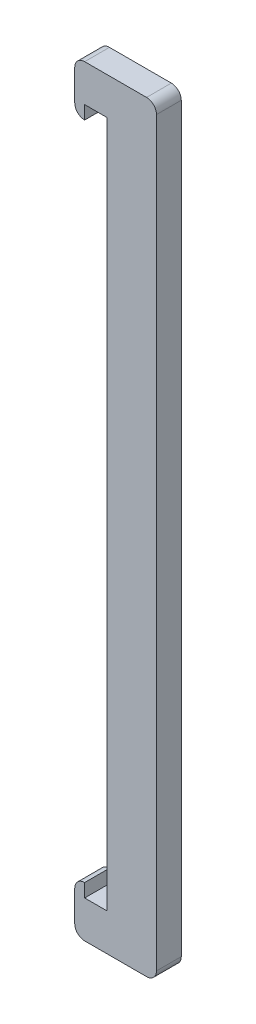
ISO-10303-21;
HEADER;
FILE_DESCRIPTION(('STEP AP214'),'2;1');
FILE_NAME('part.step','',(''),(''),'','','');
FILE_SCHEMA(('AUTOMOTIVE_DESIGN { 1 0 10303 214 1 1 1 1 }'));
ENDSEC;
DATA;
#1=APPLICATION_CONTEXT('core data for automotive mechanical design processes');
#2=APPLICATION_PROTOCOL_DEFINITION('international standard','automotive_design',2000,#1);
#3=PRODUCT_CONTEXT('',#1,'mechanical');
#4=PRODUCT('Part','Part','',(#3));
#5=PRODUCT_RELATED_PRODUCT_CATEGORY('part','',(#4));
#6=PRODUCT_DEFINITION_FORMATION('','',#4);
#7=PRODUCT_DEFINITION_CONTEXT('part definition',#1,'design');
#8=PRODUCT_DEFINITION('design','',#6,#7);
#9=PRODUCT_DEFINITION_SHAPE('','',#8);
#10=(LENGTH_UNIT() NAMED_UNIT(*) SI_UNIT(.MILLI.,.METRE.));
#11=(NAMED_UNIT(*) PLANE_ANGLE_UNIT() SI_UNIT($,.RADIAN.));
#12=(NAMED_UNIT(*) SI_UNIT($,.STERADIAN.) SOLID_ANGLE_UNIT());
#13=UNCERTAINTY_MEASURE_WITH_UNIT(LENGTH_MEASURE(1.E-05),#10,'distance_accuracy_value','');
#14=(GEOMETRIC_REPRESENTATION_CONTEXT(3) GLOBAL_UNCERTAINTY_ASSIGNED_CONTEXT((#13)) GLOBAL_UNIT_ASSIGNED_CONTEXT((#10,
#11,#12)) REPRESENTATION_CONTEXT('',''));
#15=CARTESIAN_POINT('',(0.,0.,0.));
#16=DIRECTION('',(0.,0.,1.));
#17=DIRECTION('',(1.,0.,0.));
#18=AXIS2_PLACEMENT_3D('',#15,#16,#17);
#19=CARTESIAN_POINT('',(-5.70001399999998,88.011,3.175));
#20=DIRECTION('',(0.,1.,0.));
#21=DIRECTION('',(0.,0.,1.));
#22=AXIS2_PLACEMENT_3D('',#19,#20,#21);
#23=PLANE('',#22);
#24=DIRECTION('',(1.,0.,0.));
#25=VECTOR('',#24,1.);
#26=CARTESIAN_POINT('',(-5.70001399999998,88.011,-3.175));
#27=LINE('',#26,#25);
#28=CARTESIAN_POINT('',(-5.70001399999998,88.011,-3.175));
#29=VERTEX_POINT('',#28);
#30=CARTESIAN_POINT('',(0.,88.011,-3.175));
#31=VERTEX_POINT('',#30);
#32=EDGE_CURVE('E169',#29,#31,#27,.T.);
#33=ORIENTED_EDGE('',*,*,#32,.T.);
#34=DIRECTION('',(0.,0.,-1.));
#35=VECTOR('',#34,1.);
#36=CARTESIAN_POINT('',(0.,88.011,3.175));
#37=LINE('',#36,#35);
#38=CARTESIAN_POINT('',(0.,88.011,3.175));
#39=VERTEX_POINT('',#38);
#40=EDGE_CURVE('E150',#39,#31,#37,.T.);
#41=ORIENTED_EDGE('',*,*,#40,.F.);
#42=DIRECTION('',(1.,0.,0.));
#43=VECTOR('',#42,1.);
#44=CARTESIAN_POINT('',(-5.70001399999998,88.011,3.175));
#45=LINE('',#44,#43);
#46=CARTESIAN_POINT('',(-5.70001399999998,88.011,3.175));
#47=VERTEX_POINT('',#46);
#48=EDGE_CURVE('E156',#47,#39,#45,.T.);
#49=ORIENTED_EDGE('',*,*,#48,.F.);
#50=DIRECTION('',(0.,0.,-1.));
#51=VECTOR('',#50,1.);
#52=CARTESIAN_POINT('',(-5.70001399999998,88.011,3.175));
#53=LINE('',#52,#51);
#54=EDGE_CURVE('E237',#47,#29,#53,.T.);
#55=ORIENTED_EDGE('',*,*,#54,.T.);
#56=EDGE_LOOP('',(#33,#41,#49,#55));
#57=FACE_BOUND('',#56,.T.);
#58=ADVANCED_FACE('F33',(#57),#23,.F.);
#59=CARTESIAN_POINT('',(0.,88.011,3.175));
#60=DIRECTION('',(1.,0.,0.));
#61=DIRECTION('',(0.,0.,-1.));
#62=AXIS2_PLACEMENT_3D('',#59,#60,#61);
#63=PLANE('',#62);
#64=DIRECTION('',(0.,-1.,0.));
#65=VECTOR('',#64,1.);
#66=CARTESIAN_POINT('',(0.,88.011,-3.175));
#67=LINE('',#66,#65);
#68=CARTESIAN_POINT('',(0.,-88.011,-3.175));
#69=VERTEX_POINT('',#68);
#70=EDGE_CURVE('E263',#31,#69,#67,.T.);
#71=ORIENTED_EDGE('',*,*,#70,.T.);
#72=DIRECTION('',(0.,0.,-1.));
#73=VECTOR('',#72,1.);
#74=CARTESIAN_POINT('',(0.,-88.011,3.175));
#75=LINE('',#74,#73);
#76=CARTESIAN_POINT('',(0.,-88.011,3.175));
#77=VERTEX_POINT('',#76);
#78=EDGE_CURVE('E153',#77,#69,#75,.T.);
#79=ORIENTED_EDGE('',*,*,#78,.F.);
#80=DIRECTION('',(0.,-1.,0.));
#81=VECTOR('',#80,1.);
#82=CARTESIAN_POINT('',(0.,88.011,3.175));
#83=LINE('',#82,#81);
#84=EDGE_CURVE('E146',#39,#77,#83,.T.);
#85=ORIENTED_EDGE('',*,*,#84,.F.);
#86=ORIENTED_EDGE('',*,*,#40,.T.);
#87=EDGE_LOOP('',(#71,#79,#85,#86));
#88=FACE_BOUND('',#87,.T.);
#89=ADVANCED_FACE('F148',(#88),#63,.F.);
#90=CARTESIAN_POINT('',(-5.70001399999998,-88.011,3.175));
#91=DIRECTION('',(0.,-1.,0.));
#92=DIRECTION('',(0.,0.,-1.));
#93=AXIS2_PLACEMENT_3D('',#90,#91,#92);
#94=PLANE('',#93);
#95=DIRECTION('',(-1.,0.,0.));
#96=VECTOR('',#95,1.);
#97=CARTESIAN_POINT('',(-5.70001399999998,-88.011,-3.175));
#98=LINE('',#97,#96);
#99=CARTESIAN_POINT('',(-5.70001399999998,-88.011,-3.175));
#100=VERTEX_POINT('',#99);
#101=EDGE_CURVE('E256',#69,#100,#98,.T.);
#102=ORIENTED_EDGE('',*,*,#101,.T.);
#103=DIRECTION('',(0.,0.,-1.));
#104=VECTOR('',#103,1.);
#105=CARTESIAN_POINT('',(-5.70001399999998,-88.011,3.175));
#106=LINE('',#105,#104);
#107=CARTESIAN_POINT('',(-5.70001399999998,-88.011,3.175));
#108=VERTEX_POINT('',#107);
#109=EDGE_CURVE('E174',#108,#100,#106,.T.);
#110=ORIENTED_EDGE('',*,*,#109,.F.);
#111=DIRECTION('',(-1.,0.,0.));
#112=VECTOR('',#111,1.);
#113=CARTESIAN_POINT('',(-5.70001399999998,-88.011,3.175));
#114=LINE('',#113,#112);
#115=EDGE_CURVE('E155',#77,#108,#114,.T.);
#116=ORIENTED_EDGE('',*,*,#115,.F.);
#117=ORIENTED_EDGE('',*,*,#78,.T.);
#118=EDGE_LOOP('',(#102,#110,#116,#117));
#119=FACE_BOUND('',#118,.T.);
#120=ADVANCED_FACE('F292',(#119),#94,.F.);
#121=CARTESIAN_POINT('',(-5.70001399999998,-84.582,3.175));
#122=DIRECTION('',(-1.,0.,0.));
#123=DIRECTION('',(0.,0.,1.));
#124=AXIS2_PLACEMENT_3D('',#121,#122,#123);
#125=PLANE('',#124);
#126=DIRECTION('',(0.,1.,0.));
#127=VECTOR('',#126,1.);
#128=CARTESIAN_POINT('',(-5.70001399999998,-84.582,-3.175));
#129=LINE('',#128,#127);
#130=CARTESIAN_POINT('',(-5.70001399999998,-84.582,-3.175));
#131=VERTEX_POINT('',#130);
#132=EDGE_CURVE('E252',#100,#131,#129,.T.);
#133=ORIENTED_EDGE('',*,*,#132,.T.);
#134=DIRECTION('',(0.,0.,-1.));
#135=VECTOR('',#134,1.);
#136=CARTESIAN_POINT('',(-5.70001399999998,-84.582,3.175));
#137=LINE('',#136,#135);
#138=CARTESIAN_POINT('',(-5.70001399999998,-84.582,3.175));
#139=VERTEX_POINT('',#138);
#140=EDGE_CURVE('E242',#139,#131,#137,.T.);
#141=ORIENTED_EDGE('',*,*,#140,.F.);
#142=DIRECTION('',(0.,1.,0.));
#143=VECTOR('',#142,1.);
#144=CARTESIAN_POINT('',(-5.70001399999998,-84.582,3.175));
#145=LINE('',#144,#143);
#146=EDGE_CURVE('E253',#108,#139,#145,.T.);
#147=ORIENTED_EDGE('',*,*,#146,.F.);
#148=ORIENTED_EDGE('',*,*,#109,.T.);
#149=EDGE_LOOP('',(#133,#141,#147,#148));
#150=FACE_BOUND('',#149,.T.);
#151=ADVANCED_FACE('F250',(#150),#125,.F.);
#152=CARTESIAN_POINT('',(-8.24001399999998,-97.536,3.175));
#153=DIRECTION('',(1.,0.,0.));
#154=DIRECTION('',(0.,0.,-1.));
#155=AXIS2_PLACEMENT_3D('',#152,#153,#154);
#156=PLANE('',#155);
#157=DIRECTION('',(0.,-1.,0.));
#158=VECTOR('',#157,1.);
#159=CARTESIAN_POINT('',(-8.24001399999998,-97.536,-3.175));
#160=LINE('',#159,#158);
#161=CARTESIAN_POINT('',(-8.24001399999998,-87.122,-3.175));
#162=VERTEX_POINT('',#161);
#163=CARTESIAN_POINT('',(-8.24001399999998,-94.996,-3.175));
#164=VERTEX_POINT('',#163);
#165=EDGE_CURVE('E258',#162,#164,#160,.T.);
#166=ORIENTED_EDGE('',*,*,#165,.T.);
#167=DIRECTION('',(0.,0.,-1.));
#168=VECTOR('',#167,1.);
#169=CARTESIAN_POINT('',(-8.24001399999998,-94.996,3.175));
#170=LINE('',#169,#168);
#171=CARTESIAN_POINT('',(-8.24001399999998,-94.996,3.175));
#172=VERTEX_POINT('',#171);
#173=EDGE_CURVE('E211',#164,#172,#170,.F.);
#174=ORIENTED_EDGE('',*,*,#173,.T.);
#175=DIRECTION('',(0.,-1.,0.));
#176=VECTOR('',#175,1.);
#177=CARTESIAN_POINT('',(-8.24001399999998,-97.536,3.175));
#178=LINE('',#177,#176);
#179=CARTESIAN_POINT('',(-8.24001399999998,-87.122,3.175));
#180=VERTEX_POINT('',#179);
#181=EDGE_CURVE('E294',#180,#172,#178,.T.);
#182=ORIENTED_EDGE('',*,*,#181,.F.);
#183=DIRECTION('',(0.,0.,-1.));
#184=VECTOR('',#183,1.);
#185=CARTESIAN_POINT('',(-8.24001399999998,-87.122,3.175));
#186=LINE('',#185,#184);
#187=EDGE_CURVE('E208',#180,#162,#186,.T.);
#188=ORIENTED_EDGE('',*,*,#187,.T.);
#189=EDGE_LOOP('',(#166,#174,#182,#188));
#190=FACE_BOUND('',#189,.T.);
#191=ADVANCED_FACE('F312',(#190),#156,.F.);
#192=CARTESIAN_POINT('',(12.7,-97.536,3.175));
#193=DIRECTION('',(0.,1.,0.));
#194=DIRECTION('',(0.,0.,1.));
#195=AXIS2_PLACEMENT_3D('',#192,#193,#194);
#196=PLANE('',#195);
#197=DIRECTION('',(1.,0.,0.));
#198=VECTOR('',#197,1.);
#199=CARTESIAN_POINT('',(12.7,-97.536,-3.175));
#200=LINE('',#199,#198);
#201=CARTESIAN_POINT('',(-5.70001399999998,-97.536,-3.175));
#202=VERTEX_POINT('',#201);
#203=CARTESIAN_POINT('',(10.16,-97.536,-3.175));
#204=VERTEX_POINT('',#203);
#205=EDGE_CURVE('E261',#202,#204,#200,.T.);
#206=ORIENTED_EDGE('',*,*,#205,.T.);
#207=DIRECTION('',(0.,0.,-1.));
#208=VECTOR('',#207,1.);
#209=CARTESIAN_POINT('',(10.16,-97.536,3.175));
#210=LINE('',#209,#208);
#211=CARTESIAN_POINT('',(10.16,-97.536,3.175));
#212=VERTEX_POINT('',#211);
#213=EDGE_CURVE('E195',#204,#212,#210,.F.);
#214=ORIENTED_EDGE('',*,*,#213,.T.);
#215=DIRECTION('',(1.,0.,0.));
#216=VECTOR('',#215,1.);
#217=CARTESIAN_POINT('',(12.7,-97.536,3.175));
#218=LINE('',#217,#216);
#219=CARTESIAN_POINT('',(-5.70001399999998,-97.536,3.175));
#220=VERTEX_POINT('',#219);
#221=EDGE_CURVE('E287',#220,#212,#218,.T.);
#222=ORIENTED_EDGE('',*,*,#221,.F.);
#223=DIRECTION('',(0.,0.,-1.));
#224=VECTOR('',#223,1.);
#225=CARTESIAN_POINT('',(-5.70001399999998,-97.536,3.175));
#226=LINE('',#225,#224);
#227=EDGE_CURVE('E192',#220,#202,#226,.T.);
#228=ORIENTED_EDGE('',*,*,#227,.T.);
#229=EDGE_LOOP('',(#206,#214,#222,#228));
#230=FACE_BOUND('',#229,.T.);
#231=ADVANCED_FACE('F307',(#230),#196,.F.);
#232=CARTESIAN_POINT('',(12.7,97.536,3.175));
#233=DIRECTION('',(-1.,0.,0.));
#234=DIRECTION('',(0.,0.,1.));
#235=AXIS2_PLACEMENT_3D('',#232,#233,#234);
#236=PLANE('',#235);
#237=DIRECTION('',(0.,1.,0.));
#238=VECTOR('',#237,1.);
#239=CARTESIAN_POINT('',(12.7,97.536,3.175));
#240=LINE('',#239,#238);
#241=CARTESIAN_POINT('',(12.7,-94.9959999999999,3.175));
#242=VERTEX_POINT('',#241);
#243=CARTESIAN_POINT('',(12.7,94.996,3.175));
#244=VERTEX_POINT('',#243);
#245=EDGE_CURVE('E281',#242,#244,#240,.T.);
#246=ORIENTED_EDGE('',*,*,#245,.F.);
#247=DIRECTION('',(0.,0.,-1.));
#248=VECTOR('',#247,1.);
#249=CARTESIAN_POINT('',(12.7,-94.996,3.175));
#250=LINE('',#249,#248);
#251=CARTESIAN_POINT('',(12.7,-94.9959999999999,-3.175));
#252=VERTEX_POINT('',#251);
#253=EDGE_CURVE('E172',#242,#252,#250,.T.);
#254=ORIENTED_EDGE('',*,*,#253,.T.);
#255=DIRECTION('',(0.,1.,0.));
#256=VECTOR('',#255,1.);
#257=CARTESIAN_POINT('',(12.7,97.536,-3.175));
#258=LINE('',#257,#256);
#259=CARTESIAN_POINT('',(12.7,94.996,-3.175));
#260=VERTEX_POINT('',#259);
#261=EDGE_CURVE('E233',#252,#260,#258,.T.);
#262=ORIENTED_EDGE('',*,*,#261,.T.);
#263=DIRECTION('',(0.,0.,-1.));
#264=VECTOR('',#263,1.);
#265=CARTESIAN_POINT('',(12.7,94.996,3.175));
#266=LINE('',#265,#264);
#267=EDGE_CURVE('E170',#260,#244,#266,.F.);
#268=ORIENTED_EDGE('',*,*,#267,.T.);
#269=EDGE_LOOP('',(#246,#254,#262,#268));
#270=FACE_BOUND('',#269,.T.);
#271=ADVANCED_FACE('F272',(#270),#236,.F.);
#272=CARTESIAN_POINT('',(12.7,97.536,3.175));
#273=DIRECTION('',(0.,-1.,0.));
#274=DIRECTION('',(0.,0.,-1.));
#275=AXIS2_PLACEMENT_3D('',#272,#273,#274);
#276=PLANE('',#275);
#277=DIRECTION('',(-1.,0.,0.));
#278=VECTOR('',#277,1.);
#279=CARTESIAN_POINT('',(12.7,97.536,3.175));
#280=LINE('',#279,#278);
#281=CARTESIAN_POINT('',(10.16,97.536,3.175));
#282=VERTEX_POINT('',#281);
#283=CARTESIAN_POINT('',(-5.70001399999998,97.536,3.175));
#284=VERTEX_POINT('',#283);
#285=EDGE_CURVE('E280',#282,#284,#280,.T.);
#286=ORIENTED_EDGE('',*,*,#285,.F.);
#287=DIRECTION('',(0.,0.,-1.));
#288=VECTOR('',#287,1.);
#289=CARTESIAN_POINT('',(10.16,97.536,3.175));
#290=LINE('',#289,#288);
#291=CARTESIAN_POINT('',(10.16,97.536,-3.175));
#292=VERTEX_POINT('',#291);
#293=EDGE_CURVE('E215',#282,#292,#290,.T.);
#294=ORIENTED_EDGE('',*,*,#293,.T.);
#295=DIRECTION('',(-1.,0.,0.));
#296=VECTOR('',#295,1.);
#297=CARTESIAN_POINT('',(12.7,97.536,-3.175));
#298=LINE('',#297,#296);
#299=CARTESIAN_POINT('',(-5.70001399999998,97.536,-3.175));
#300=VERTEX_POINT('',#299);
#301=EDGE_CURVE('E230',#292,#300,#298,.T.);
#302=ORIENTED_EDGE('',*,*,#301,.T.);
#303=DIRECTION('',(0.,0.,-1.));
#304=VECTOR('',#303,1.);
#305=CARTESIAN_POINT('',(-5.70001399999998,97.536,3.175));
#306=LINE('',#305,#304);
#307=EDGE_CURVE('E213',#300,#284,#306,.F.);
#308=ORIENTED_EDGE('',*,*,#307,.T.);
#309=EDGE_LOOP('',(#286,#294,#302,#308));
#310=FACE_BOUND('',#309,.T.);
#311=ADVANCED_FACE('F283',(#310),#276,.F.);
#312=CARTESIAN_POINT('',(-8.24001399999998,97.536,3.175));
#313=DIRECTION('',(1.,0.,0.));
#314=DIRECTION('',(0.,0.,-1.));
#315=AXIS2_PLACEMENT_3D('',#312,#313,#314);
#316=PLANE('',#315);
#317=DIRECTION('',(0.,-1.,0.));
#318=VECTOR('',#317,1.);
#319=CARTESIAN_POINT('',(-8.24001399999998,97.536,-3.175));
#320=LINE('',#319,#318);
#321=CARTESIAN_POINT('',(-8.24001399999998,94.996,-3.175));
#322=VERTEX_POINT('',#321);
#323=CARTESIAN_POINT('',(-8.24001399999998,87.122,-3.175));
#324=VERTEX_POINT('',#323);
#325=EDGE_CURVE('E221',#322,#324,#320,.T.);
#326=ORIENTED_EDGE('',*,*,#325,.T.);
#327=DIRECTION('',(0.,0.,-1.));
#328=VECTOR('',#327,1.);
#329=CARTESIAN_POINT('',(-8.24001399999998,87.122,3.175));
#330=LINE('',#329,#328);
#331=CARTESIAN_POINT('',(-8.24001399999998,87.122,3.175));
#332=VERTEX_POINT('',#331);
#333=EDGE_CURVE('E11',#324,#332,#330,.F.);
#334=ORIENTED_EDGE('',*,*,#333,.T.);
#335=DIRECTION('',(0.,-1.,0.));
#336=VECTOR('',#335,1.);
#337=CARTESIAN_POINT('',(-8.24001399999998,97.536,3.175));
#338=LINE('',#337,#336);
#339=CARTESIAN_POINT('',(-8.24001399999998,94.996,3.175));
#340=VERTEX_POINT('',#339);
#341=EDGE_CURVE('E222',#340,#332,#338,.T.);
#342=ORIENTED_EDGE('',*,*,#341,.F.);
#343=DIRECTION('',(0.,0.,-1.));
#344=VECTOR('',#343,1.);
#345=CARTESIAN_POINT('',(-8.24001399999998,94.996,3.175));
#346=LINE('',#345,#344);
#347=EDGE_CURVE('E41',#340,#322,#346,.T.);
#348=ORIENTED_EDGE('',*,*,#347,.T.);
#349=EDGE_LOOP('',(#326,#334,#342,#348));
#350=FACE_BOUND('',#349,.T.);
#351=ADVANCED_FACE('F220',(#350),#316,.F.);
#352=CARTESIAN_POINT('',(-5.70001399999998,84.582,3.175));
#353=DIRECTION('',(-1.,0.,0.));
#354=DIRECTION('',(0.,0.,1.));
#355=AXIS2_PLACEMENT_3D('',#352,#353,#354);
#356=PLANE('',#355);
#357=DIRECTION('',(0.,1.,0.));
#358=VECTOR('',#357,1.);
#359=CARTESIAN_POINT('',(-5.70001399999998,84.582,-3.175));
#360=LINE('',#359,#358);
#361=CARTESIAN_POINT('',(-5.70001399999998,84.582,-3.175));
#362=VERTEX_POINT('',#361);
#363=EDGE_CURVE('E166',#362,#29,#360,.T.);
#364=ORIENTED_EDGE('',*,*,#363,.T.);
#365=ORIENTED_EDGE('',*,*,#54,.F.);
#366=DIRECTION('',(0.,1.,0.));
#367=VECTOR('',#366,1.);
#368=CARTESIAN_POINT('',(-5.70001399999998,84.582,3.175));
#369=LINE('',#368,#367);
#370=CARTESIAN_POINT('',(-5.70001399999998,84.582,3.175));
#371=VERTEX_POINT('',#370);
#372=EDGE_CURVE('E162',#371,#47,#369,.T.);
#373=ORIENTED_EDGE('',*,*,#372,.F.);
#374=DIRECTION('',(0.,0.,-1.));
#375=VECTOR('',#374,1.);
#376=CARTESIAN_POINT('',(-5.70001399999998,84.582,3.175));
#377=LINE('',#376,#375);
#378=EDGE_CURVE('E239',#371,#362,#377,.T.);
#379=ORIENTED_EDGE('',*,*,#378,.T.);
#380=EDGE_LOOP('',(#364,#365,#373,#379));
#381=FACE_BOUND('',#380,.T.);
#382=ADVANCED_FACE('F343',(#381),#356,.F.);
#383=CARTESIAN_POINT('',(0.,0.,3.175));
#384=DIRECTION('',(0.,0.,-1.));
#385=DIRECTION('',(-1.,0.,0.));
#386=AXIS2_PLACEMENT_3D('',#383,#384,#385);
#387=PLANE('',#386);
#388=ORIENTED_EDGE('',*,*,#221,.T.);
#389=CARTESIAN_POINT('',(10.16,-94.996,3.175));
#390=DIRECTION('',(0.,0.,-1.));
#391=DIRECTION('',(-1.,0.,0.));
#392=AXIS2_PLACEMENT_3D('',#389,#390,#391);
#393=CIRCLE('',#392,2.54);
#394=EDGE_CURVE('E206',#212,#242,#393,.F.);
#395=ORIENTED_EDGE('',*,*,#394,.T.);
#396=ORIENTED_EDGE('',*,*,#245,.T.);
#397=CARTESIAN_POINT('',(10.16,94.996,3.175));
#398=DIRECTION('',(0.,0.,-1.));
#399=DIRECTION('',(-1.,0.,0.));
#400=AXIS2_PLACEMENT_3D('',#397,#398,#399);
#401=CIRCLE('',#400,2.54);
#402=EDGE_CURVE('E200',#244,#282,#401,.F.);
#403=ORIENTED_EDGE('',*,*,#402,.T.);
#404=ORIENTED_EDGE('',*,*,#285,.T.);
#405=CARTESIAN_POINT('',(-5.70001399999998,94.996,3.175));
#406=DIRECTION('',(0.,0.,-1.));
#407=DIRECTION('',(-1.,0.,0.));
#408=AXIS2_PLACEMENT_3D('',#405,#406,#407);
#409=CIRCLE('',#408,2.54);
#410=EDGE_CURVE('E53',#284,#340,#409,.F.);
#411=ORIENTED_EDGE('',*,*,#410,.T.);
#412=ORIENTED_EDGE('',*,*,#341,.T.);
#413=CARTESIAN_POINT('',(-5.70001399999998,87.122,3.175));
#414=DIRECTION('',(0.,0.,-1.));
#415=DIRECTION('',(-1.,0.,0.));
#416=AXIS2_PLACEMENT_3D('',#413,#414,#415);
#417=CIRCLE('',#416,2.54);
#418=EDGE_CURVE('E198',#332,#371,#417,.F.);
#419=ORIENTED_EDGE('',*,*,#418,.T.);
#420=ORIENTED_EDGE('',*,*,#372,.T.);
#421=ORIENTED_EDGE('',*,*,#48,.T.);
#422=ORIENTED_EDGE('',*,*,#84,.T.);
#423=ORIENTED_EDGE('',*,*,#115,.T.);
#424=ORIENTED_EDGE('',*,*,#146,.T.);
#425=CARTESIAN_POINT('',(-5.70001399999998,-87.122,3.175));
#426=DIRECTION('',(0.,0.,-1.));
#427=DIRECTION('',(-1.,0.,0.));
#428=AXIS2_PLACEMENT_3D('',#425,#426,#427);
#429=CIRCLE('',#428,2.54);
#430=EDGE_CURVE('E202',#139,#180,#429,.F.);
#431=ORIENTED_EDGE('',*,*,#430,.T.);
#432=ORIENTED_EDGE('',*,*,#181,.T.);
#433=CARTESIAN_POINT('',(-5.70001399999998,-94.996,3.175));
#434=DIRECTION('',(0.,0.,-1.));
#435=DIRECTION('',(-1.,0.,0.));
#436=AXIS2_PLACEMENT_3D('',#433,#434,#435);
#437=CIRCLE('',#436,2.54);
#438=EDGE_CURVE('E204',#172,#220,#437,.F.);
#439=ORIENTED_EDGE('',*,*,#438,.T.);
#440=EDGE_LOOP('',(#388,#395,#396,#403,#404,#411,#412,#419,#420,#421,#422,#423,#424,#431,#432,#439));
#441=FACE_BOUND('',#440,.T.);
#442=ADVANCED_FACE('F160',(#441),#387,.F.);
#443=CARTESIAN_POINT('',(0.,0.,-3.175));
#444=DIRECTION('',(0.,0.,-1.));
#445=DIRECTION('',(-1.,0.,0.));
#446=AXIS2_PLACEMENT_3D('',#443,#444,#445);
#447=PLANE('',#446);
#448=ORIENTED_EDGE('',*,*,#261,.F.);
#449=CARTESIAN_POINT('',(10.16,-94.996,-3.175));
#450=DIRECTION('',(0.,0.,-1.));
#451=DIRECTION('',(-1.,0.,0.));
#452=AXIS2_PLACEMENT_3D('',#449,#450,#451);
#453=CIRCLE('',#452,2.54);
#454=EDGE_CURVE('E190',#252,#204,#453,.T.);
#455=ORIENTED_EDGE('',*,*,#454,.T.);
#456=ORIENTED_EDGE('',*,*,#205,.F.);
#457=CARTESIAN_POINT('',(-5.70001399999998,-94.996,-3.175));
#458=DIRECTION('',(0.,0.,-1.));
#459=DIRECTION('',(-1.,0.,0.));
#460=AXIS2_PLACEMENT_3D('',#457,#458,#459);
#461=CIRCLE('',#460,2.54);
#462=EDGE_CURVE('E188',#202,#164,#461,.T.);
#463=ORIENTED_EDGE('',*,*,#462,.T.);
#464=ORIENTED_EDGE('',*,*,#165,.F.);
#465=CARTESIAN_POINT('',(-5.70001399999998,-87.122,-3.175));
#466=DIRECTION('',(0.,0.,-1.));
#467=DIRECTION('',(-1.,0.,0.));
#468=AXIS2_PLACEMENT_3D('',#465,#466,#467);
#469=CIRCLE('',#468,2.54);
#470=EDGE_CURVE('E186',#162,#131,#469,.T.);
#471=ORIENTED_EDGE('',*,*,#470,.T.);
#472=ORIENTED_EDGE('',*,*,#132,.F.);
#473=ORIENTED_EDGE('',*,*,#101,.F.);
#474=ORIENTED_EDGE('',*,*,#70,.F.);
#475=ORIENTED_EDGE('',*,*,#32,.F.);
#476=ORIENTED_EDGE('',*,*,#363,.F.);
#477=CARTESIAN_POINT('',(-5.70001399999998,87.122,-3.175));
#478=DIRECTION('',(0.,0.,-1.));
#479=DIRECTION('',(-1.,0.,0.));
#480=AXIS2_PLACEMENT_3D('',#477,#478,#479);
#481=CIRCLE('',#480,2.54);
#482=EDGE_CURVE('E182',#362,#324,#481,.T.);
#483=ORIENTED_EDGE('',*,*,#482,.T.);
#484=ORIENTED_EDGE('',*,*,#325,.F.);
#485=CARTESIAN_POINT('',(-5.70001399999998,94.996,-3.175));
#486=DIRECTION('',(0.,0.,-1.));
#487=DIRECTION('',(-1.,0.,0.));
#488=AXIS2_PLACEMENT_3D('',#485,#486,#487);
#489=CIRCLE('',#488,2.54);
#490=EDGE_CURVE('E180',#322,#300,#489,.T.);
#491=ORIENTED_EDGE('',*,*,#490,.T.);
#492=ORIENTED_EDGE('',*,*,#301,.F.);
#493=CARTESIAN_POINT('',(10.16,94.996,-3.175));
#494=DIRECTION('',(0.,0.,-1.));
#495=DIRECTION('',(-1.,0.,0.));
#496=AXIS2_PLACEMENT_3D('',#493,#494,#495);
#497=CIRCLE('',#496,2.54);
#498=EDGE_CURVE('E184',#292,#260,#497,.T.);
#499=ORIENTED_EDGE('',*,*,#498,.T.);
#500=EDGE_LOOP('',(#448,#455,#456,#463,#464,#471,#472,#473,#474,#475,#476,#483,#484,#491,#492,#499));
#501=FACE_BOUND('',#500,.T.);
#502=ADVANCED_FACE('F226',(#501),#447,.T.);
#503=CARTESIAN_POINT('',(10.16,-94.996,3.175));
#504=DIRECTION('',(0.,0.,-1.));
#505=DIRECTION('',(-1.,0.,0.));
#506=AXIS2_PLACEMENT_3D('',#503,#504,#505);
#507=CYLINDRICAL_SURFACE('',#506,2.54);
#508=ORIENTED_EDGE('',*,*,#394,.F.);
#509=ORIENTED_EDGE('',*,*,#213,.F.);
#510=ORIENTED_EDGE('',*,*,#454,.F.);
#511=ORIENTED_EDGE('',*,*,#253,.F.);
#512=EDGE_LOOP('',(#508,#509,#510,#511));
#513=FACE_BOUND('',#512,.T.);
#514=ADVANCED_FACE('F305',(#513),#507,.T.);
#515=CARTESIAN_POINT('',(-5.70001399999998,-94.996,3.175));
#516=DIRECTION('',(0.,0.,-1.));
#517=DIRECTION('',(-1.,0.,0.));
#518=AXIS2_PLACEMENT_3D('',#515,#516,#517);
#519=CYLINDRICAL_SURFACE('',#518,2.54);
#520=ORIENTED_EDGE('',*,*,#438,.F.);
#521=ORIENTED_EDGE('',*,*,#173,.F.);
#522=ORIENTED_EDGE('',*,*,#462,.F.);
#523=ORIENTED_EDGE('',*,*,#227,.F.);
#524=EDGE_LOOP('',(#520,#521,#522,#523));
#525=FACE_BOUND('',#524,.T.);
#526=ADVANCED_FACE('F309',(#525),#519,.T.);
#527=CARTESIAN_POINT('',(-5.70001399999998,-87.122,3.175));
#528=DIRECTION('',(0.,0.,-1.));
#529=DIRECTION('',(-1.,0.,0.));
#530=AXIS2_PLACEMENT_3D('',#527,#528,#529);
#531=CYLINDRICAL_SURFACE('',#530,2.54);
#532=ORIENTED_EDGE('',*,*,#430,.F.);
#533=ORIENTED_EDGE('',*,*,#140,.T.);
#534=ORIENTED_EDGE('',*,*,#470,.F.);
#535=ORIENTED_EDGE('',*,*,#187,.F.);
#536=EDGE_LOOP('',(#532,#533,#534,#535));
#537=FACE_BOUND('',#536,.T.);
#538=ADVANCED_FACE('F317',(#537),#531,.T.);
#539=CARTESIAN_POINT('',(10.16,94.996,3.175));
#540=DIRECTION('',(0.,0.,-1.));
#541=DIRECTION('',(-1.,0.,0.));
#542=AXIS2_PLACEMENT_3D('',#539,#540,#541);
#543=CYLINDRICAL_SURFACE('',#542,2.54);
#544=ORIENTED_EDGE('',*,*,#402,.F.);
#545=ORIENTED_EDGE('',*,*,#267,.F.);
#546=ORIENTED_EDGE('',*,*,#498,.F.);
#547=ORIENTED_EDGE('',*,*,#293,.F.);
#548=EDGE_LOOP('',(#544,#545,#546,#547));
#549=FACE_BOUND('',#548,.T.);
#550=ADVANCED_FACE('F277',(#549),#543,.T.);
#551=CARTESIAN_POINT('',(-5.70001399999998,87.122,3.175));
#552=DIRECTION('',(0.,0.,-1.));
#553=DIRECTION('',(-1.,0.,0.));
#554=AXIS2_PLACEMENT_3D('',#551,#552,#553);
#555=CYLINDRICAL_SURFACE('',#554,2.54);
#556=ORIENTED_EDGE('',*,*,#418,.F.);
#557=ORIENTED_EDGE('',*,*,#333,.F.);
#558=ORIENTED_EDGE('',*,*,#482,.F.);
#559=ORIENTED_EDGE('',*,*,#378,.F.);
#560=EDGE_LOOP('',(#556,#557,#558,#559));
#561=FACE_BOUND('',#560,.T.);
#562=ADVANCED_FACE('F324',(#561),#555,.T.);
#563=CARTESIAN_POINT('',(-5.70001399999998,94.996,3.175));
#564=DIRECTION('',(0.,0.,-1.));
#565=DIRECTION('',(-1.,0.,0.));
#566=AXIS2_PLACEMENT_3D('',#563,#564,#565);
#567=CYLINDRICAL_SURFACE('',#566,2.54);
#568=ORIENTED_EDGE('',*,*,#410,.F.);
#569=ORIENTED_EDGE('',*,*,#307,.F.);
#570=ORIENTED_EDGE('',*,*,#490,.F.);
#571=ORIENTED_EDGE('',*,*,#347,.F.);
#572=EDGE_LOOP('',(#568,#569,#570,#571));
#573=FACE_BOUND('',#572,.T.);
#574=ADVANCED_FACE('F35',(#573),#567,.T.);
#575=CLOSED_SHELL('',(#58,#89,#120,#151,#191,#231,#271,#311,#351,#382,#442,#502,#514,#526,#538,
#550,#562,#574));
#576=MANIFOLD_SOLID_BREP('B2',#575);
#577=ADVANCED_BREP_SHAPE_REPRESENTATION('',(#18,#576),#14);
#578=SHAPE_DEFINITION_REPRESENTATION(#9,#577);
ENDSEC;
END-ISO-10303-21;
